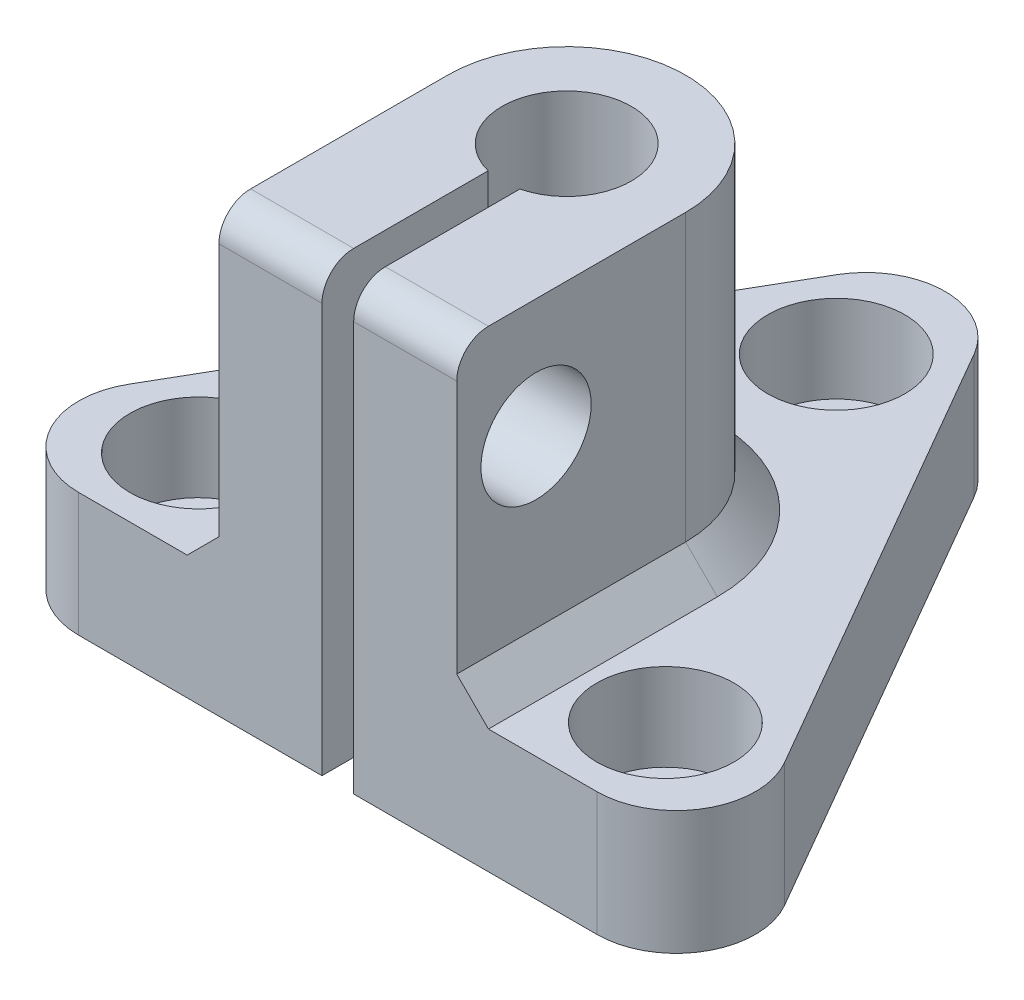
ISO-10303-21;
HEADER;
FILE_DESCRIPTION(('STEP AP214'),'2;1');
FILE_NAME('part.step','',(''),(''),'','','');
FILE_SCHEMA(('AUTOMOTIVE_DESIGN { 1 0 10303 214 1 1 1 1 }'));
ENDSEC;
DATA;
#1=APPLICATION_CONTEXT('core data for automotive mechanical design processes');
#2=APPLICATION_PROTOCOL_DEFINITION('international standard','automotive_design',2000,#1);
#3=PRODUCT_CONTEXT('',#1,'mechanical');
#4=PRODUCT('Part','Part','',(#3));
#5=PRODUCT_RELATED_PRODUCT_CATEGORY('part','',(#4));
#6=PRODUCT_DEFINITION_FORMATION('','',#4);
#7=PRODUCT_DEFINITION_CONTEXT('part definition',#1,'design');
#8=PRODUCT_DEFINITION('design','',#6,#7);
#9=PRODUCT_DEFINITION_SHAPE('','',#8);
#10=(LENGTH_UNIT() NAMED_UNIT(*) SI_UNIT(.MILLI.,.METRE.));
#11=(NAMED_UNIT(*) PLANE_ANGLE_UNIT() SI_UNIT($,.RADIAN.));
#12=(NAMED_UNIT(*) SI_UNIT($,.STERADIAN.) SOLID_ANGLE_UNIT());
#13=UNCERTAINTY_MEASURE_WITH_UNIT(LENGTH_MEASURE(1.E-05),#10,'distance_accuracy_value','');
#14=(GEOMETRIC_REPRESENTATION_CONTEXT(3) GLOBAL_UNCERTAINTY_ASSIGNED_CONTEXT((#13)) GLOBAL_UNIT_ASSIGNED_CONTEXT((#10,
#11,#12)) REPRESENTATION_CONTEXT('',''));
#15=CARTESIAN_POINT('',(0.,0.,0.));
#16=DIRECTION('',(0.,0.,1.));
#17=DIRECTION('',(1.,0.,0.));
#18=AXIS2_PLACEMENT_3D('',#15,#16,#17);
#19=CARTESIAN_POINT('',(-21.3397459621556,20.3,9.43375672974063));
#20=DIRECTION('',(1.,0.,0.));
#21=DIRECTION('',(0.,0.,-1.));
#22=AXIS2_PLACEMENT_3D('',#19,#20,#21);
#23=CYLINDRICAL_SURFACE('',#22,2.05);
#24=CARTESIAN_POINT('',(1.,20.3,9.43375672974064));
#25=DIRECTION('',(1.,0.,0.));
#26=DIRECTION('',(0.,0.,-1.));
#27=AXIS2_PLACEMENT_3D('',#24,#25,#26);
#28=CIRCLE('',#27,2.05);
#29=CARTESIAN_POINT('',(1.,20.3,7.38375672974064));
#30=VERTEX_POINT('',#29);
#31=EDGE_CURVE('E292',#30,#30,#28,.T.);
#32=ORIENTED_EDGE('',*,*,#31,.F.);
#33=EDGE_LOOP('',(#32));
#34=FACE_BOUND('',#33,.T.);
#35=CARTESIAN_POINT('',(2.53,20.3,9.43375672974064));
#36=DIRECTION('',(1.,0.,0.));
#37=DIRECTION('',(0.,0.,-1.));
#38=AXIS2_PLACEMENT_3D('',#35,#36,#37);
#39=CIRCLE('',#38,2.05);
#40=CARTESIAN_POINT('',(2.53,20.3,7.38375672974064));
#41=VERTEX_POINT('',#40);
#42=EDGE_CURVE('E450',#41,#41,#39,.F.);
#43=ORIENTED_EDGE('',*,*,#42,.F.);
#44=EDGE_LOOP('',(#43));
#45=FACE_BOUND('',#44,.T.);
#46=ADVANCED_FACE('F41',(#34,#45),#23,.F.);
#47=CARTESIAN_POINT('',(0.,7.8,-17.));
#48=DIRECTION('',(0.,-1.,0.));
#49=DIRECTION('',(0.,0.,-1.));
#50=AXIS2_PLACEMENT_3D('',#47,#48,#49);
#51=CYLINDRICAL_SURFACE('',#50,2.575);
#52=CARTESIAN_POINT('',(0.,0.,-17.));
#53=DIRECTION('',(0.,1.,0.));
#54=DIRECTION('',(0.,0.,1.));
#55=AXIS2_PLACEMENT_3D('',#52,#53,#54);
#56=CIRCLE('',#55,2.575);
#57=CARTESIAN_POINT('',(0.,0.,-14.425));
#58=VERTEX_POINT('',#57);
#59=EDGE_CURVE('E362',#58,#58,#56,.T.);
#60=ORIENTED_EDGE('',*,*,#59,.F.);
#61=EDGE_LOOP('',(#60));
#62=FACE_BOUND('',#61,.T.);
#63=CARTESIAN_POINT('',(0.,2.3,-17.));
#64=DIRECTION('',(0.,1.,0.));
#65=DIRECTION('',(0.,0.,1.));
#66=AXIS2_PLACEMENT_3D('',#63,#64,#65);
#67=CIRCLE('',#66,2.575);
#68=CARTESIAN_POINT('',(0.,2.3,-14.425));
#69=VERTEX_POINT('',#68);
#70=EDGE_CURVE('E258',#69,#69,#67,.T.);
#71=ORIENTED_EDGE('',*,*,#70,.T.);
#72=EDGE_LOOP('',(#71));
#73=FACE_BOUND('',#72,.T.);
#74=ADVANCED_FACE('F585',(#62,#73),#51,.F.);
#75=CARTESIAN_POINT('',(-14.7224318643355,7.8,8.50000000000001));
#76=DIRECTION('',(0.,-1.,0.));
#77=DIRECTION('',(0.,0.,-1.));
#78=AXIS2_PLACEMENT_3D('',#75,#76,#77);
#79=CYLINDRICAL_SURFACE('',#78,2.575);
#80=CARTESIAN_POINT('',(-14.7224318643355,0.,8.50000000000001));
#81=DIRECTION('',(0.,1.,0.));
#82=DIRECTION('',(0.,0.,1.));
#83=AXIS2_PLACEMENT_3D('',#80,#81,#82);
#84=CIRCLE('',#83,2.575);
#85=CARTESIAN_POINT('',(-14.7224318643355,0.,11.075));
#86=VERTEX_POINT('',#85);
#87=EDGE_CURVE('E358',#86,#86,#84,.T.);
#88=ORIENTED_EDGE('',*,*,#87,.F.);
#89=EDGE_LOOP('',(#88));
#90=FACE_BOUND('',#89,.T.);
#91=CARTESIAN_POINT('',(-14.7224318643355,2.3,8.50000000000001));
#92=DIRECTION('',(0.,1.,0.));
#93=DIRECTION('',(0.,0.,1.));
#94=AXIS2_PLACEMENT_3D('',#91,#92,#93);
#95=CIRCLE('',#94,2.575);
#96=CARTESIAN_POINT('',(-14.7224318643355,2.3,11.075));
#97=VERTEX_POINT('',#96);
#98=EDGE_CURVE('E442',#97,#97,#95,.T.);
#99=ORIENTED_EDGE('',*,*,#98,.T.);
#100=EDGE_LOOP('',(#99));
#101=FACE_BOUND('',#100,.T.);
#102=ADVANCED_FACE('F592',(#90,#101),#79,.F.);
#103=CARTESIAN_POINT('',(14.7224318643355,7.8,8.5));
#104=DIRECTION('',(0.,-1.,0.));
#105=DIRECTION('',(0.,0.,-1.));
#106=AXIS2_PLACEMENT_3D('',#103,#104,#105);
#107=CYLINDRICAL_SURFACE('',#106,2.575);
#108=CARTESIAN_POINT('',(14.7224318643355,0.,8.5));
#109=DIRECTION('',(0.,1.,0.));
#110=DIRECTION('',(0.,0.,1.));
#111=AXIS2_PLACEMENT_3D('',#108,#109,#110);
#112=CIRCLE('',#111,2.575);
#113=CARTESIAN_POINT('',(14.7224318643355,0.,11.075));
#114=VERTEX_POINT('',#113);
#115=EDGE_CURVE('E354',#114,#114,#112,.T.);
#116=ORIENTED_EDGE('',*,*,#115,.F.);
#117=EDGE_LOOP('',(#116));
#118=FACE_BOUND('',#117,.T.);
#119=CARTESIAN_POINT('',(14.7224318643355,2.3,8.5));
#120=DIRECTION('',(0.,1.,0.));
#121=DIRECTION('',(0.,0.,1.));
#122=AXIS2_PLACEMENT_3D('',#119,#120,#121);
#123=CIRCLE('',#122,2.575);
#124=CARTESIAN_POINT('',(14.7224318643355,2.3,11.075));
#125=VERTEX_POINT('',#124);
#126=EDGE_CURVE('E438',#125,#125,#123,.T.);
#127=ORIENTED_EDGE('',*,*,#126,.T.);
#128=EDGE_LOOP('',(#127));
#129=FACE_BOUND('',#128,.T.);
#130=ADVANCED_FACE('F600',(#118,#129),#107,.F.);
#131=CARTESIAN_POINT('',(-1.,20.3,9.43375672974064));
#132=DIRECTION('',(-1.,0.,0.));
#133=DIRECTION('',(0.,0.,1.));
#134=AXIS2_PLACEMENT_3D('',#131,#132,#133);
#135=CIRCLE('',#134,2.05);
#136=CARTESIAN_POINT('',(-1.,20.3,11.4837567297406));
#137=VERTEX_POINT('',#136);
#138=EDGE_CURVE('E287',#137,#137,#135,.T.);
#139=ORIENTED_EDGE('',*,*,#138,.F.);
#140=EDGE_LOOP('',(#139));
#141=FACE_BOUND('',#140,.T.);
#142=CARTESIAN_POINT('',(-4.25,20.3,9.43375672974064));
#143=DIRECTION('',(-1.,0.,0.));
#144=DIRECTION('',(0.,0.,1.));
#145=AXIS2_PLACEMENT_3D('',#142,#143,#144);
#146=CIRCLE('',#145,2.05);
#147=CARTESIAN_POINT('',(-4.25,20.3,11.4837567297406));
#148=VERTEX_POINT('',#147);
#149=EDGE_CURVE('E275',#148,#148,#146,.F.);
#150=ORIENTED_EDGE('',*,*,#149,.F.);
#151=EDGE_LOOP('',(#150));
#152=FACE_BOUND('',#151,.T.);
#153=ADVANCED_FACE('F588',(#141,#152),#23,.F.);
#154=CARTESIAN_POINT('',(-25.,7.8,14.4337567297406));
#155=DIRECTION('',(0.,0.,-1.));
#156=DIRECTION('',(-1.,0.,0.));
#157=AXIS2_PLACEMENT_3D('',#154,#155,#156);
#158=PLANE('',#157);
#159=DIRECTION('',(1.,0.,0.));
#160=VECTOR('',#159,1.);
#161=CARTESIAN_POINT('',(-25.,7.8,14.4337567297406));
#162=LINE('',#161,#160);
#163=CARTESIAN_POINT('',(9.50000000000002,7.8,14.4337567297406));
#164=VERTEX_POINT('',#163);
#165=CARTESIAN_POINT('',(16.3397459621556,7.8,14.4337567297407));
#166=VERTEX_POINT('',#165);
#167=EDGE_CURVE('E371',#164,#166,#162,.T.);
#168=ORIENTED_EDGE('',*,*,#167,.F.);
#169=DIRECTION('',(0.707106781186551,-0.707106781186544,0.));
#170=VECTOR('',#169,1.);
#171=CARTESIAN_POINT('',(-7.75000000000015,25.05,14.4337567297406));
#172=LINE('',#171,#170);
#173=CARTESIAN_POINT('',(7.5,9.8,14.4337567297406));
#174=VERTEX_POINT('',#173);
#175=EDGE_CURVE('E11',#164,#174,#172,.F.);
#176=ORIENTED_EDGE('',*,*,#175,.T.);
#177=DIRECTION('',(0.,1.,0.));
#178=VECTOR('',#177,1.);
#179=CARTESIAN_POINT('',(7.5,-13.0166599946613,14.4337567297406));
#180=LINE('',#179,#178);
#181=CARTESIAN_POINT('',(7.5,25.8,14.4337567297406));
#182=VERTEX_POINT('',#181);
#183=EDGE_CURVE('E343',#174,#182,#180,.T.);
#184=ORIENTED_EDGE('',*,*,#183,.T.);
#185=DIRECTION('',(1.,0.,0.));
#186=VECTOR('',#185,1.);
#187=CARTESIAN_POINT('',(1.,25.8,14.4337567297406));
#188=LINE('',#187,#186);
#189=CARTESIAN_POINT('',(1.,25.8,14.4337567297406));
#190=VERTEX_POINT('',#189);
#191=EDGE_CURVE('E476',#182,#190,#188,.F.);
#192=ORIENTED_EDGE('',*,*,#191,.T.);
#193=DIRECTION('',(0.,1.,0.));
#194=VECTOR('',#193,1.);
#195=CARTESIAN_POINT('',(1.,0.,14.4337567297406));
#196=LINE('',#195,#194);
#197=CARTESIAN_POINT('',(1.,0.,14.4337567297406));
#198=VERTEX_POINT('',#197);
#199=EDGE_CURVE('E313',#198,#190,#196,.T.);
#200=ORIENTED_EDGE('',*,*,#199,.F.);
#201=DIRECTION('',(1.,0.,0.));
#202=VECTOR('',#201,1.);
#203=CARTESIAN_POINT('',(-25.,0.,14.4337567297406));
#204=LINE('',#203,#202);
#205=CARTESIAN_POINT('',(16.3397459621556,0.,14.4337567297407));
#206=VERTEX_POINT('',#205);
#207=EDGE_CURVE('E385',#198,#206,#204,.T.);
#208=ORIENTED_EDGE('',*,*,#207,.T.);
#209=DIRECTION('',(0.,-1.,0.));
#210=VECTOR('',#209,1.);
#211=CARTESIAN_POINT('',(16.3397459621556,7.8,14.4337567297407));
#212=LINE('',#211,#210);
#213=EDGE_CURVE('E427',#206,#166,#212,.F.);
#214=ORIENTED_EDGE('',*,*,#213,.T.);
#215=EDGE_LOOP('',(#168,#176,#184,#192,#200,#208,#214));
#216=FACE_BOUND('',#215,.T.);
#217=ADVANCED_FACE('F552',(#216),#158,.F.);
#218=CARTESIAN_POINT('',(0.,7.8,0.));
#219=DIRECTION('',(0.,1.,0.));
#220=DIRECTION('',(0.,0.,1.));
#221=AXIS2_PLACEMENT_3D('',#218,#219,#220);
#222=PLANE('',#221);
#223=CARTESIAN_POINT('',(0.,7.8,-17.));
#224=DIRECTION('',(0.,1.,0.));
#225=DIRECTION('',(0.,0.,1.));
#226=AXIS2_PLACEMENT_3D('',#223,#224,#225);
#227=CIRCLE('',#226,4.325);
#228=CARTESIAN_POINT('',(0.,7.8,-12.675));
#229=VERTEX_POINT('',#228);
#230=EDGE_CURVE('E526',#229,#229,#227,.T.);
#231=ORIENTED_EDGE('',*,*,#230,.F.);
#232=EDGE_LOOP('',(#231));
#233=FACE_BOUND('',#232,.T.);
#234=CARTESIAN_POINT('',(14.7224318643355,7.8,8.5));
#235=DIRECTION('',(0.,1.,0.));
#236=DIRECTION('',(0.,0.,1.));
#237=AXIS2_PLACEMENT_3D('',#234,#235,#236);
#238=CIRCLE('',#237,4.325);
#239=CARTESIAN_POINT('',(14.7224318643355,7.8,12.825));
#240=VERTEX_POINT('',#239);
#241=EDGE_CURVE('E534',#240,#240,#238,.T.);
#242=ORIENTED_EDGE('',*,*,#241,.F.);
#243=EDGE_LOOP('',(#242));
#244=FACE_BOUND('',#243,.T.);
#245=CARTESIAN_POINT('',(-14.7224318643355,7.8,8.50000000000001));
#246=DIRECTION('',(0.,1.,0.));
#247=DIRECTION('',(0.,0.,1.));
#248=AXIS2_PLACEMENT_3D('',#245,#246,#247);
#249=CIRCLE('',#248,4.325);
#250=CARTESIAN_POINT('',(-14.7224318643355,7.8,12.825));
#251=VERTEX_POINT('',#250);
#252=EDGE_CURVE('E241',#251,#251,#249,.T.);
#253=ORIENTED_EDGE('',*,*,#252,.F.);
#254=EDGE_LOOP('',(#253));
#255=FACE_BOUND('',#254,.T.);
#256=CARTESIAN_POINT('',(-16.3397459621556,7.8,14.4337567297406));
#257=VERTEX_POINT('',#256);
#258=CARTESIAN_POINT('',(-9.50000000000002,7.8,14.4337567297406));
#259=VERTEX_POINT('',#258);
#260=EDGE_CURVE('E373',#257,#259,#162,.T.);
#261=ORIENTED_EDGE('',*,*,#260,.T.);
#262=DIRECTION('',(0.,0.,-1.));
#263=VECTOR('',#262,1.);
#264=CARTESIAN_POINT('',(-9.50000000000002,7.8,0.));
#265=LINE('',#264,#263);
#266=CARTESIAN_POINT('',(-9.50000000000002,7.8,0.));
#267=VERTEX_POINT('',#266);
#268=EDGE_CURVE('E488',#259,#267,#265,.T.);
#269=ORIENTED_EDGE('',*,*,#268,.T.);
#270=CARTESIAN_POINT('',(0.,7.8,0.));
#271=DIRECTION('',(0.,1.,0.));
#272=DIRECTION('',(0.,0.,1.));
#273=AXIS2_PLACEMENT_3D('',#270,#271,#272);
#274=CIRCLE('',#273,9.50000000000002);
#275=CARTESIAN_POINT('',(9.50000000000002,7.8,0.));
#276=VERTEX_POINT('',#275);
#277=EDGE_CURVE('E485',#267,#276,#274,.F.);
#278=ORIENTED_EDGE('',*,*,#277,.T.);
#279=DIRECTION('',(0.,0.,1.));
#280=VECTOR('',#279,1.);
#281=CARTESIAN_POINT('',(9.50000000000002,7.8,14.4337567297406));
#282=LINE('',#281,#280);
#283=EDGE_CURVE('E482',#276,#164,#282,.T.);
#284=ORIENTED_EDGE('',*,*,#283,.T.);
#285=ORIENTED_EDGE('',*,*,#167,.T.);
#286=CARTESIAN_POINT('',(16.3397459621556,7.8,9.43375672974065));
#287=DIRECTION('',(0.,1.,0.));
#288=DIRECTION('',(0.,0.,1.));
#289=AXIS2_PLACEMENT_3D('',#286,#287,#288);
#290=CIRCLE('',#289,5.);
#291=CARTESIAN_POINT('',(20.6698729810778,7.8,6.93375672974065));
#292=VERTEX_POINT('',#291);
#293=EDGE_CURVE('E414',#166,#292,#290,.T.);
#294=ORIENTED_EDGE('',*,*,#293,.T.);
#295=DIRECTION('',(-0.5,0.,-0.866025403784439));
#296=VECTOR('',#295,1.);
#297=CARTESIAN_POINT('',(25.,7.8,14.4337567297407));
#298=LINE('',#297,#296);
#299=CARTESIAN_POINT('',(4.33012701892219,7.8,-21.3675134594813));
#300=VERTEX_POINT('',#299);
#301=EDGE_CURVE('E377',#292,#300,#298,.T.);
#302=ORIENTED_EDGE('',*,*,#301,.T.);
#303=CARTESIAN_POINT('',(0.,7.8,-18.8675134594813));
#304=DIRECTION('',(0.,1.,0.));
#305=DIRECTION('',(0.,0.,1.));
#306=AXIS2_PLACEMENT_3D('',#303,#304,#305);
#307=CIRCLE('',#306,5.);
#308=CARTESIAN_POINT('',(-4.33012701892219,7.8,-21.3675134594813));
#309=VERTEX_POINT('',#308);
#310=EDGE_CURVE('E420',#300,#309,#307,.T.);
#311=ORIENTED_EDGE('',*,*,#310,.T.);
#312=DIRECTION('',(-0.5,0.,0.866025403784438));
#313=VECTOR('',#312,1.);
#314=CARTESIAN_POINT('',(0.,7.8,-28.8675134594813));
#315=LINE('',#314,#313);
#316=CARTESIAN_POINT('',(-20.6698729810778,7.8,6.93375672974063));
#317=VERTEX_POINT('',#316);
#318=EDGE_CURVE('E367',#309,#317,#315,.T.);
#319=ORIENTED_EDGE('',*,*,#318,.T.);
#320=CARTESIAN_POINT('',(-16.3397459621556,7.8,9.43375672974064));
#321=DIRECTION('',(0.,1.,0.));
#322=DIRECTION('',(0.,0.,1.));
#323=AXIS2_PLACEMENT_3D('',#320,#321,#322);
#324=CIRCLE('',#323,5.);
#325=EDGE_CURVE('E417',#317,#257,#324,.T.);
#326=ORIENTED_EDGE('',*,*,#325,.T.);
#327=EDGE_LOOP('',(#261,#269,#278,#284,#285,#294,#302,#311,#319,#326));
#328=FACE_BOUND('',#327,.T.);
#329=ADVANCED_FACE('F548',(#233,#244,#255,#328),#222,.T.);
#330=CARTESIAN_POINT('',(0.,0.,0.));
#331=DIRECTION('',(0.,1.,0.));
#332=DIRECTION('',(0.,0.,1.));
#333=AXIS2_PLACEMENT_3D('',#330,#331,#332);
#334=PLANE('',#333);
#335=DIRECTION('',(-0.5,0.,0.866025403784438));
#336=VECTOR('',#335,1.);
#337=CARTESIAN_POINT('',(0.,0.,-28.8675134594813));
#338=LINE('',#337,#336);
#339=CARTESIAN_POINT('',(-4.33012701892219,0.,-21.3675134594813));
#340=VERTEX_POINT('',#339);
#341=CARTESIAN_POINT('',(-20.6698729810778,0.,6.93375672974063));
#342=VERTEX_POINT('',#341);
#343=EDGE_CURVE('E366',#340,#342,#338,.T.);
#344=ORIENTED_EDGE('',*,*,#343,.F.);
#345=CARTESIAN_POINT('',(0.,0.,-18.8675134594813));
#346=DIRECTION('',(0.,1.,0.));
#347=DIRECTION('',(0.,0.,1.));
#348=AXIS2_PLACEMENT_3D('',#345,#346,#347);
#349=CIRCLE('',#348,5.);
#350=CARTESIAN_POINT('',(4.33012701892219,0.,-21.3675134594813));
#351=VERTEX_POINT('',#350);
#352=EDGE_CURVE('E404',#340,#351,#349,.F.);
#353=ORIENTED_EDGE('',*,*,#352,.T.);
#354=DIRECTION('',(-0.5,0.,-0.866025403784439));
#355=VECTOR('',#354,1.);
#356=CARTESIAN_POINT('',(25.,0.,14.4337567297407));
#357=LINE('',#356,#355);
#358=CARTESIAN_POINT('',(20.6698729810778,0.,6.93375672974065));
#359=VERTEX_POINT('',#358);
#360=EDGE_CURVE('E372',#359,#351,#357,.T.);
#361=ORIENTED_EDGE('',*,*,#360,.F.);
#362=CARTESIAN_POINT('',(16.3397459621556,0.,9.43375672974065));
#363=DIRECTION('',(0.,1.,0.));
#364=DIRECTION('',(0.,0.,1.));
#365=AXIS2_PLACEMENT_3D('',#362,#363,#364);
#366=CIRCLE('',#365,5.);
#367=EDGE_CURVE('E398',#359,#206,#366,.F.);
#368=ORIENTED_EDGE('',*,*,#367,.T.);
#369=ORIENTED_EDGE('',*,*,#207,.F.);
#370=DIRECTION('',(0.,0.,-1.));
#371=VECTOR('',#370,1.);
#372=CARTESIAN_POINT('',(1.,0.,3.95555305867587));
#373=LINE('',#372,#371);
#374=CARTESIAN_POINT('',(1.,0.,3.95555305867587));
#375=VERTEX_POINT('',#374);
#376=EDGE_CURVE('E297',#198,#375,#373,.T.);
#377=ORIENTED_EDGE('',*,*,#376,.T.);
#378=CARTESIAN_POINT('',(0.,0.,0.));
#379=DIRECTION('',(0.,1.,0.));
#380=DIRECTION('',(0.,0.,1.));
#381=AXIS2_PLACEMENT_3D('',#378,#379,#380);
#382=CIRCLE('',#381,4.08);
#383=CARTESIAN_POINT('',(-1.,0.,3.95555305867587));
#384=VERTEX_POINT('',#383);
#385=EDGE_CURVE('E323',#375,#384,#382,.T.);
#386=ORIENTED_EDGE('',*,*,#385,.T.);
#387=DIRECTION('',(0.,0.,1.));
#388=VECTOR('',#387,1.);
#389=CARTESIAN_POINT('',(-1.,0.,3.95555305867587));
#390=LINE('',#389,#388);
#391=CARTESIAN_POINT('',(-1.,0.,14.4337567297406));
#392=VERTEX_POINT('',#391);
#393=EDGE_CURVE('E293',#384,#392,#390,.T.);
#394=ORIENTED_EDGE('',*,*,#393,.T.);
#395=CARTESIAN_POINT('',(-16.3397459621556,0.,14.4337567297406));
#396=VERTEX_POINT('',#395);
#397=EDGE_CURVE('E386',#396,#392,#204,.T.);
#398=ORIENTED_EDGE('',*,*,#397,.F.);
#399=CARTESIAN_POINT('',(-16.3397459621556,0.,9.43375672974064));
#400=DIRECTION('',(0.,1.,0.));
#401=DIRECTION('',(0.,0.,1.));
#402=AXIS2_PLACEMENT_3D('',#399,#400,#401);
#403=CIRCLE('',#402,5.);
#404=EDGE_CURVE('E401',#396,#342,#403,.F.);
#405=ORIENTED_EDGE('',*,*,#404,.T.);
#406=EDGE_LOOP('',(#344,#353,#361,#368,#369,#377,#386,#394,#398,#405));
#407=FACE_BOUND('',#406,.T.);
#408=ORIENTED_EDGE('',*,*,#59,.T.);
#409=EDGE_LOOP('',(#408));
#410=FACE_BOUND('',#409,.T.);
#411=ORIENTED_EDGE('',*,*,#87,.T.);
#412=EDGE_LOOP('',(#411));
#413=FACE_BOUND('',#412,.T.);
#414=ORIENTED_EDGE('',*,*,#115,.T.);
#415=EDGE_LOOP('',(#414));
#416=FACE_BOUND('',#415,.T.);
#417=ADVANCED_FACE('F551',(#407,#410,#413,#416),#334,.F.);
#418=CARTESIAN_POINT('',(0.,7.8,-28.8675134594813));
#419=DIRECTION('',(0.866025403784439,0.,0.5));
#420=DIRECTION('',(0.5,0.,-0.866025403784439));
#421=AXIS2_PLACEMENT_3D('',#418,#419,#420);
#422=PLANE('',#421);
#423=ORIENTED_EDGE('',*,*,#318,.F.);
#424=DIRECTION('',(0.,-1.,0.));
#425=VECTOR('',#424,1.);
#426=CARTESIAN_POINT('',(-4.33012701892219,7.8,-21.3675134594813));
#427=LINE('',#426,#425);
#428=EDGE_CURVE('E394',#309,#340,#427,.T.);
#429=ORIENTED_EDGE('',*,*,#428,.T.);
#430=ORIENTED_EDGE('',*,*,#343,.T.);
#431=DIRECTION('',(0.,-1.,0.));
#432=VECTOR('',#431,1.);
#433=CARTESIAN_POINT('',(-20.6698729810778,7.8,6.93375672974064));
#434=LINE('',#433,#432);
#435=EDGE_CURVE('E381',#342,#317,#434,.F.);
#436=ORIENTED_EDGE('',*,*,#435,.T.);
#437=EDGE_LOOP('',(#423,#429,#430,#436));
#438=FACE_BOUND('',#437,.T.);
#439=ADVANCED_FACE('F680',(#438),#422,.F.);
#440=DIRECTION('',(0.,1.,0.));
#441=VECTOR('',#440,1.);
#442=CARTESIAN_POINT('',(-1.,0.,14.4337567297406));
#443=LINE('',#442,#441);
#444=CARTESIAN_POINT('',(-1.,25.8,14.4337567297406));
#445=VERTEX_POINT('',#444);
#446=EDGE_CURVE('E317',#392,#445,#443,.T.);
#447=ORIENTED_EDGE('',*,*,#446,.T.);
#448=DIRECTION('',(1.,0.,0.));
#449=VECTOR('',#448,1.);
#450=CARTESIAN_POINT('',(-7.5,25.8,14.4337567297406));
#451=LINE('',#450,#449);
#452=CARTESIAN_POINT('',(-7.5,25.8,14.4337567297406));
#453=VERTEX_POINT('',#452);
#454=EDGE_CURVE('E465',#445,#453,#451,.F.);
#455=ORIENTED_EDGE('',*,*,#454,.T.);
#456=DIRECTION('',(0.,1.,0.));
#457=VECTOR('',#456,1.);
#458=CARTESIAN_POINT('',(-7.5,-13.0166599946613,14.4337567297406));
#459=LINE('',#458,#457);
#460=CARTESIAN_POINT('',(-7.5,9.8,14.4337567297406));
#461=VERTEX_POINT('',#460);
#462=EDGE_CURVE('E346',#461,#453,#459,.T.);
#463=ORIENTED_EDGE('',*,*,#462,.F.);
#464=DIRECTION('',(0.707106781186551,0.707106781186544,0.));
#465=VECTOR('',#464,1.);
#466=CARTESIAN_POINT('',(-17.2500000000001,0.050000000000011,14.4337567297406));
#467=LINE('',#466,#465);
#468=EDGE_CURVE('E52',#461,#259,#467,.F.);
#469=ORIENTED_EDGE('',*,*,#468,.T.);
#470=ORIENTED_EDGE('',*,*,#260,.F.);
#471=DIRECTION('',(0.,-1.,0.));
#472=VECTOR('',#471,1.);
#473=CARTESIAN_POINT('',(-16.3397459621556,7.8,14.4337567297406));
#474=LINE('',#473,#472);
#475=EDGE_CURVE('E423',#257,#396,#474,.T.);
#476=ORIENTED_EDGE('',*,*,#475,.T.);
#477=ORIENTED_EDGE('',*,*,#397,.T.);
#478=EDGE_LOOP('',(#447,#455,#463,#469,#470,#476,#477));
#479=FACE_BOUND('',#478,.T.);
#480=ADVANCED_FACE('F562',(#479),#158,.F.);
#481=CARTESIAN_POINT('',(25.,7.8,14.4337567297407));
#482=DIRECTION('',(-0.866025403784439,0.,0.5));
#483=DIRECTION('',(0.5,0.,0.866025403784439));
#484=AXIS2_PLACEMENT_3D('',#481,#482,#483);
#485=PLANE('',#484);
#486=ORIENTED_EDGE('',*,*,#360,.T.);
#487=DIRECTION('',(0.,-1.,0.));
#488=VECTOR('',#487,1.);
#489=CARTESIAN_POINT('',(4.33012701892219,7.8,-21.3675134594813));
#490=LINE('',#489,#488);
#491=EDGE_CURVE('E411',#351,#300,#490,.F.);
#492=ORIENTED_EDGE('',*,*,#491,.T.);
#493=ORIENTED_EDGE('',*,*,#301,.F.);
#494=DIRECTION('',(0.,-1.,0.));
#495=VECTOR('',#494,1.);
#496=CARTESIAN_POINT('',(20.6698729810778,7.8,6.93375672974065));
#497=LINE('',#496,#495);
#498=EDGE_CURVE('E407',#292,#359,#497,.T.);
#499=ORIENTED_EDGE('',*,*,#498,.T.);
#500=EDGE_LOOP('',(#486,#492,#493,#499));
#501=FACE_BOUND('',#500,.T.);
#502=ADVANCED_FACE('F682',(#501),#485,.F.);
#503=CARTESIAN_POINT('',(0.,27.8,0.));
#504=DIRECTION('',(0.,-1.,0.));
#505=DIRECTION('',(0.,0.,-1.));
#506=AXIS2_PLACEMENT_3D('',#503,#504,#505);
#507=CYLINDRICAL_SURFACE('',#506,7.5);
#508=DIRECTION('',(0.,1.,0.));
#509=VECTOR('',#508,1.);
#510=CARTESIAN_POINT('',(7.5,-13.0166599946613,0.));
#511=LINE('',#510,#509);
#512=CARTESIAN_POINT('',(7.5,9.8,0.));
#513=VERTEX_POINT('',#512);
#514=CARTESIAN_POINT('',(7.5,27.8,0.));
#515=VERTEX_POINT('',#514);
#516=EDGE_CURVE('E339',#513,#515,#511,.T.);
#517=ORIENTED_EDGE('',*,*,#516,.F.);
#518=CARTESIAN_POINT('',(0.,9.8,0.));
#519=DIRECTION('',(0.,1.,0.));
#520=DIRECTION('',(0.,0.,1.));
#521=AXIS2_PLACEMENT_3D('',#518,#519,#520);
#522=CIRCLE('',#521,7.5);
#523=CARTESIAN_POINT('',(-7.5,9.8,0.));
#524=VERTEX_POINT('',#523);
#525=EDGE_CURVE('E495',#513,#524,#522,.T.);
#526=ORIENTED_EDGE('',*,*,#525,.T.);
#527=DIRECTION('',(0.,1.,0.));
#528=VECTOR('',#527,1.);
#529=CARTESIAN_POINT('',(-7.5,-13.0166599946613,0.));
#530=LINE('',#529,#528);
#531=CARTESIAN_POINT('',(-7.5,27.8,0.));
#532=VERTEX_POINT('',#531);
#533=EDGE_CURVE('E338',#524,#532,#530,.T.);
#534=ORIENTED_EDGE('',*,*,#533,.T.);
#535=CARTESIAN_POINT('',(0.,27.8,0.));
#536=DIRECTION('',(0.,1.,0.));
#537=DIRECTION('',(0.,0.,1.));
#538=AXIS2_PLACEMENT_3D('',#535,#536,#537);
#539=CIRCLE('',#538,7.5);
#540=EDGE_CURVE('E342',#515,#532,#539,.T.);
#541=ORIENTED_EDGE('',*,*,#540,.F.);
#542=EDGE_LOOP('',(#517,#526,#534,#541));
#543=FACE_BOUND('',#542,.T.);
#544=ADVANCED_FACE('F571',(#543),#507,.T.);
#545=CARTESIAN_POINT('',(0.,27.8,0.));
#546=DIRECTION('',(0.,1.,0.));
#547=DIRECTION('',(0.,0.,1.));
#548=AXIS2_PLACEMENT_3D('',#545,#546,#547);
#549=PLANE('',#548);
#550=DIRECTION('',(0.,0.,1.));
#551=VECTOR('',#550,1.);
#552=CARTESIAN_POINT('',(-7.5,27.8,0.));
#553=LINE('',#552,#551);
#554=CARTESIAN_POINT('',(-7.5,27.8,12.4337567297406));
#555=VERTEX_POINT('',#554);
#556=EDGE_CURVE('E327',#532,#555,#553,.T.);
#557=ORIENTED_EDGE('',*,*,#556,.T.);
#558=DIRECTION('',(1.,0.,0.));
#559=VECTOR('',#558,1.);
#560=CARTESIAN_POINT('',(-0.999999999999999,27.8,12.4337567297406));
#561=LINE('',#560,#559);
#562=CARTESIAN_POINT('',(-1.,27.8,12.4337567297406));
#563=VERTEX_POINT('',#562);
#564=EDGE_CURVE('E458',#555,#563,#561,.T.);
#565=ORIENTED_EDGE('',*,*,#564,.T.);
#566=DIRECTION('',(0.,0.,1.));
#567=VECTOR('',#566,1.);
#568=CARTESIAN_POINT('',(-1.,27.8,3.95555305867587));
#569=LINE('',#568,#567);
#570=CARTESIAN_POINT('',(-1.,27.8,3.95555305867587));
#571=VERTEX_POINT('',#570);
#572=EDGE_CURVE('E291',#571,#563,#569,.T.);
#573=ORIENTED_EDGE('',*,*,#572,.F.);
#574=CARTESIAN_POINT('',(0.,27.8,0.));
#575=DIRECTION('',(0.,1.,0.));
#576=DIRECTION('',(0.,0.,1.));
#577=AXIS2_PLACEMENT_3D('',#574,#575,#576);
#578=CIRCLE('',#577,4.08);
#579=CARTESIAN_POINT('',(1.,27.8,3.95555305867587));
#580=VERTEX_POINT('',#579);
#581=EDGE_CURVE('E312',#580,#571,#578,.T.);
#582=ORIENTED_EDGE('',*,*,#581,.F.);
#583=DIRECTION('',(0.,0.,-1.));
#584=VECTOR('',#583,1.);
#585=CARTESIAN_POINT('',(1.,27.8,3.95555305867587));
#586=LINE('',#585,#584);
#587=CARTESIAN_POINT('',(1.,27.8,12.4337567297406));
#588=VERTEX_POINT('',#587);
#589=EDGE_CURVE('E298',#588,#580,#586,.T.);
#590=ORIENTED_EDGE('',*,*,#589,.F.);
#591=DIRECTION('',(1.,0.,0.));
#592=VECTOR('',#591,1.);
#593=CARTESIAN_POINT('',(7.5,27.8,12.4337567297406));
#594=LINE('',#593,#592);
#595=CARTESIAN_POINT('',(7.5,27.8,12.4337567297406));
#596=VERTEX_POINT('',#595);
#597=EDGE_CURVE('E431',#588,#596,#594,.T.);
#598=ORIENTED_EDGE('',*,*,#597,.T.);
#599=DIRECTION('',(0.,0.,-1.));
#600=VECTOR('',#599,1.);
#601=CARTESIAN_POINT('',(7.5,27.8,0.));
#602=LINE('',#601,#600);
#603=EDGE_CURVE('E334',#596,#515,#602,.T.);
#604=ORIENTED_EDGE('',*,*,#603,.T.);
#605=ORIENTED_EDGE('',*,*,#540,.T.);
#606=EDGE_LOOP('',(#557,#565,#573,#582,#590,#598,#604,#605));
#607=FACE_BOUND('',#606,.T.);
#608=ADVANCED_FACE('F744',(#607),#549,.T.);
#609=CARTESIAN_POINT('',(7.5,-13.0166599946613,0.));
#610=DIRECTION('',(1.,0.,0.));
#611=DIRECTION('',(0.,0.,-1.));
#612=AXIS2_PLACEMENT_3D('',#609,#610,#611);
#613=PLANE('',#612);
#614=CARTESIAN_POINT('',(7.5,20.3,9.43375672974064));
#615=DIRECTION('',(1.,0.,0.));
#616=DIRECTION('',(0.,0.,-1.));
#617=AXIS2_PLACEMENT_3D('',#614,#615,#616);
#618=CIRCLE('',#617,3.475);
#619=CARTESIAN_POINT('',(7.5,20.3,5.95875672974064));
#620=VERTEX_POINT('',#619);
#621=EDGE_CURVE('E510',#620,#620,#618,.T.);
#622=ORIENTED_EDGE('',*,*,#621,.F.);
#623=EDGE_LOOP('',(#622));
#624=FACE_BOUND('',#623,.T.);
#625=ORIENTED_EDGE('',*,*,#183,.F.);
#626=DIRECTION('',(0.,0.,-1.));
#627=VECTOR('',#626,1.);
#628=CARTESIAN_POINT('',(7.5,9.8,0.));
#629=LINE('',#628,#627);
#630=EDGE_CURVE('E65',#174,#513,#629,.T.);
#631=ORIENTED_EDGE('',*,*,#630,.T.);
#632=ORIENTED_EDGE('',*,*,#516,.T.);
#633=ORIENTED_EDGE('',*,*,#603,.F.);
#634=CARTESIAN_POINT('',(7.5,25.8,12.4337567297406));
#635=DIRECTION('',(1.,0.,0.));
#636=DIRECTION('',(0.,0.,-1.));
#637=AXIS2_PLACEMENT_3D('',#634,#635,#636);
#638=CIRCLE('',#637,2.);
#639=EDGE_CURVE('E472',#596,#182,#638,.T.);
#640=ORIENTED_EDGE('',*,*,#639,.T.);
#641=EDGE_LOOP('',(#625,#631,#632,#633,#640));
#642=FACE_BOUND('',#641,.T.);
#643=ADVANCED_FACE('F732',(#624,#642),#613,.T.);
#644=CARTESIAN_POINT('',(-7.5,-13.0166599946613,0.));
#645=DIRECTION('',(-1.,0.,0.));
#646=DIRECTION('',(0.,0.,1.));
#647=AXIS2_PLACEMENT_3D('',#644,#645,#646);
#648=PLANE('',#647);
#649=DIRECTION('',(0.,0.866025403784439,-0.5));
#650=VECTOR('',#649,1.);
#651=CARTESIAN_POINT('',(-7.5,20.3,13.5040761275275));
#652=LINE('',#651,#650);
#653=CARTESIAN_POINT('',(-7.5,20.3,13.5040761275275));
#654=VERTEX_POINT('',#653);
#655=CARTESIAN_POINT('',(-7.5,23.825,11.4689164286341));
#656=VERTEX_POINT('',#655);
#657=EDGE_CURVE('E212',#654,#656,#652,.T.);
#658=ORIENTED_EDGE('',*,*,#657,.F.);
#659=DIRECTION('',(0.,0.866025403784439,0.5));
#660=VECTOR('',#659,1.);
#661=CARTESIAN_POINT('',(-7.5,16.775,11.4689164286341));
#662=LINE('',#661,#660);
#663=CARTESIAN_POINT('',(-7.5,16.775,11.4689164286341));
#664=VERTEX_POINT('',#663);
#665=EDGE_CURVE('E234',#664,#654,#662,.T.);
#666=ORIENTED_EDGE('',*,*,#665,.F.);
#667=DIRECTION('',(0.,0.,1.));
#668=VECTOR('',#667,1.);
#669=CARTESIAN_POINT('',(-7.5,16.775,7.39859703084721));
#670=LINE('',#669,#668);
#671=CARTESIAN_POINT('',(-7.5,16.775,7.39859703084721));
#672=VERTEX_POINT('',#671);
#673=EDGE_CURVE('E238',#672,#664,#670,.T.);
#674=ORIENTED_EDGE('',*,*,#673,.F.);
#675=DIRECTION('',(0.,-0.866025403784439,0.5));
#676=VECTOR('',#675,1.);
#677=CARTESIAN_POINT('',(-7.5,20.3,5.36343733195377));
#678=LINE('',#677,#676);
#679=CARTESIAN_POINT('',(-7.5,20.3,5.36343733195377));
#680=VERTEX_POINT('',#679);
#681=EDGE_CURVE('E265',#680,#672,#678,.T.);
#682=ORIENTED_EDGE('',*,*,#681,.F.);
#683=DIRECTION('',(0.,-0.866025403784439,-0.5));
#684=VECTOR('',#683,1.);
#685=CARTESIAN_POINT('',(-7.5,23.825,7.3985970308472));
#686=LINE('',#685,#684);
#687=CARTESIAN_POINT('',(-7.5,23.825,7.3985970308472));
#688=VERTEX_POINT('',#687);
#689=EDGE_CURVE('E261',#688,#680,#686,.T.);
#690=ORIENTED_EDGE('',*,*,#689,.F.);
#691=DIRECTION('',(0.,0.,-1.));
#692=VECTOR('',#691,1.);
#693=CARTESIAN_POINT('',(-7.5,23.825,11.4689164286341));
#694=LINE('',#693,#692);
#695=EDGE_CURVE('E257',#656,#688,#694,.T.);
#696=ORIENTED_EDGE('',*,*,#695,.F.);
#697=EDGE_LOOP('',(#658,#666,#674,#682,#690,#696));
#698=FACE_BOUND('',#697,.T.);
#699=ORIENTED_EDGE('',*,*,#533,.F.);
#700=DIRECTION('',(0.,0.,1.));
#701=VECTOR('',#700,1.);
#702=CARTESIAN_POINT('',(-7.5,9.8,14.4337567297406));
#703=LINE('',#702,#701);
#704=EDGE_CURVE('E492',#524,#461,#703,.T.);
#705=ORIENTED_EDGE('',*,*,#704,.T.);
#706=ORIENTED_EDGE('',*,*,#462,.T.);
#707=CARTESIAN_POINT('',(-7.5,25.8,12.4337567297406));
#708=DIRECTION('',(-1.,0.,0.));
#709=DIRECTION('',(0.,0.,1.));
#710=AXIS2_PLACEMENT_3D('',#707,#708,#709);
#711=CIRCLE('',#710,2.);
#712=EDGE_CURVE('E469',#453,#555,#711,.T.);
#713=ORIENTED_EDGE('',*,*,#712,.T.);
#714=ORIENTED_EDGE('',*,*,#556,.F.);
#715=EDGE_LOOP('',(#699,#705,#706,#713,#714));
#716=FACE_BOUND('',#715,.T.);
#717=ADVANCED_FACE('F567',(#698,#716),#648,.T.);
#718=CARTESIAN_POINT('',(0.,0.,0.));
#719=DIRECTION('',(0.,1.,0.));
#720=DIRECTION('',(0.,0.,1.));
#721=AXIS2_PLACEMENT_3D('',#718,#719,#720);
#722=CYLINDRICAL_SURFACE('',#721,4.08);
#723=ORIENTED_EDGE('',*,*,#385,.F.);
#724=DIRECTION('',(0.,1.,0.));
#725=VECTOR('',#724,1.);
#726=CARTESIAN_POINT('',(1.,0.,3.95555305867587));
#727=LINE('',#726,#725);
#728=EDGE_CURVE('E308',#375,#580,#727,.T.);
#729=ORIENTED_EDGE('',*,*,#728,.T.);
#730=ORIENTED_EDGE('',*,*,#581,.T.);
#731=DIRECTION('',(0.,1.,0.));
#732=VECTOR('',#731,1.);
#733=CARTESIAN_POINT('',(-1.,0.,3.95555305867587));
#734=LINE('',#733,#732);
#735=EDGE_CURVE('E302',#384,#571,#734,.T.);
#736=ORIENTED_EDGE('',*,*,#735,.F.);
#737=EDGE_LOOP('',(#723,#729,#730,#736));
#738=FACE_BOUND('',#737,.T.);
#739=ADVANCED_FACE('F731',(#738),#722,.F.);
#740=CARTESIAN_POINT('',(-1.,0.,3.95555305867587));
#741=DIRECTION('',(-1.,0.,0.));
#742=DIRECTION('',(0.,0.,1.));
#743=AXIS2_PLACEMENT_3D('',#740,#741,#742);
#744=PLANE('',#743);
#745=ORIENTED_EDGE('',*,*,#138,.T.);
#746=EDGE_LOOP('',(#745));
#747=FACE_BOUND('',#746,.T.);
#748=ORIENTED_EDGE('',*,*,#572,.T.);
#749=CARTESIAN_POINT('',(-1.,25.8,12.4337567297406));
#750=DIRECTION('',(-1.,0.,0.));
#751=DIRECTION('',(0.,0.,1.));
#752=AXIS2_PLACEMENT_3D('',#749,#750,#751);
#753=CIRCLE('',#752,2.);
#754=EDGE_CURVE('E462',#563,#445,#753,.F.);
#755=ORIENTED_EDGE('',*,*,#754,.T.);
#756=ORIENTED_EDGE('',*,*,#446,.F.);
#757=ORIENTED_EDGE('',*,*,#393,.F.);
#758=ORIENTED_EDGE('',*,*,#735,.T.);
#759=EDGE_LOOP('',(#748,#755,#756,#757,#758));
#760=FACE_BOUND('',#759,.T.);
#761=ADVANCED_FACE('F800',(#747,#760),#744,.F.);
#762=CARTESIAN_POINT('',(1.,0.,3.95555305867587));
#763=DIRECTION('',(1.,0.,0.));
#764=DIRECTION('',(0.,0.,-1.));
#765=AXIS2_PLACEMENT_3D('',#762,#763,#764);
#766=PLANE('',#765);
#767=ORIENTED_EDGE('',*,*,#31,.T.);
#768=EDGE_LOOP('',(#767));
#769=FACE_BOUND('',#768,.T.);
#770=ORIENTED_EDGE('',*,*,#199,.T.);
#771=CARTESIAN_POINT('',(1.,25.8,12.4337567297406));
#772=DIRECTION('',(1.,0.,0.));
#773=DIRECTION('',(0.,0.,-1.));
#774=AXIS2_PLACEMENT_3D('',#771,#772,#773);
#775=CIRCLE('',#774,2.);
#776=EDGE_CURVE('E479',#190,#588,#775,.F.);
#777=ORIENTED_EDGE('',*,*,#776,.T.);
#778=ORIENTED_EDGE('',*,*,#589,.T.);
#779=ORIENTED_EDGE('',*,*,#728,.F.);
#780=ORIENTED_EDGE('',*,*,#376,.F.);
#781=EDGE_LOOP('',(#770,#777,#778,#779,#780));
#782=FACE_BOUND('',#781,.T.);
#783=ADVANCED_FACE('F693',(#769,#782),#766,.F.);
#784=CARTESIAN_POINT('',(0.,7.8,-18.8675134594813));
#785=DIRECTION('',(0.,-1.,0.));
#786=DIRECTION('',(0.,0.,-1.));
#787=AXIS2_PLACEMENT_3D('',#784,#785,#786);
#788=CYLINDRICAL_SURFACE('',#787,5.);
#789=ORIENTED_EDGE('',*,*,#310,.F.);
#790=ORIENTED_EDGE('',*,*,#491,.F.);
#791=ORIENTED_EDGE('',*,*,#352,.F.);
#792=ORIENTED_EDGE('',*,*,#428,.F.);
#793=EDGE_LOOP('',(#789,#790,#791,#792));
#794=FACE_BOUND('',#793,.T.);
#795=ADVANCED_FACE('F690',(#794),#788,.T.);
#796=CARTESIAN_POINT('',(-16.3397459621556,7.8,9.43375672974064));
#797=DIRECTION('',(0.,-1.,0.));
#798=DIRECTION('',(0.,0.,-1.));
#799=AXIS2_PLACEMENT_3D('',#796,#797,#798);
#800=CYLINDRICAL_SURFACE('',#799,5.);
#801=ORIENTED_EDGE('',*,*,#325,.F.);
#802=ORIENTED_EDGE('',*,*,#435,.F.);
#803=ORIENTED_EDGE('',*,*,#404,.F.);
#804=ORIENTED_EDGE('',*,*,#475,.F.);
#805=EDGE_LOOP('',(#801,#802,#803,#804));
#806=FACE_BOUND('',#805,.T.);
#807=ADVANCED_FACE('F620',(#806),#800,.T.);
#808=CARTESIAN_POINT('',(16.3397459621556,7.8,9.43375672974065));
#809=DIRECTION('',(0.,-1.,0.));
#810=DIRECTION('',(0.,0.,-1.));
#811=AXIS2_PLACEMENT_3D('',#808,#809,#810);
#812=CYLINDRICAL_SURFACE('',#811,5.);
#813=ORIENTED_EDGE('',*,*,#293,.F.);
#814=ORIENTED_EDGE('',*,*,#213,.F.);
#815=ORIENTED_EDGE('',*,*,#367,.F.);
#816=ORIENTED_EDGE('',*,*,#498,.F.);
#817=EDGE_LOOP('',(#813,#814,#815,#816));
#818=FACE_BOUND('',#817,.T.);
#819=ADVANCED_FACE('F613',(#818),#812,.T.);
#820=CARTESIAN_POINT('',(-4.25,0.,0.));
#821=DIRECTION('',(-1.,0.,0.));
#822=DIRECTION('',(0.,0.,1.));
#823=AXIS2_PLACEMENT_3D('',#820,#821,#822);
#824=PLANE('',#823);
#825=DIRECTION('',(0.,0.866025403784439,-0.5));
#826=VECTOR('',#825,1.);
#827=CARTESIAN_POINT('',(-4.25,20.3,13.5040761275275));
#828=LINE('',#827,#826);
#829=CARTESIAN_POINT('',(-4.25,20.3,13.5040761275275));
#830=VERTEX_POINT('',#829);
#831=CARTESIAN_POINT('',(-4.25,23.825,11.4689164286341));
#832=VERTEX_POINT('',#831);
#833=EDGE_CURVE('E209',#830,#832,#828,.T.);
#834=ORIENTED_EDGE('',*,*,#833,.T.);
#835=DIRECTION('',(0.,0.,-1.));
#836=VECTOR('',#835,1.);
#837=CARTESIAN_POINT('',(-4.25,23.825,11.4689164286341));
#838=LINE('',#837,#836);
#839=CARTESIAN_POINT('',(-4.25,23.825,7.3985970308472));
#840=VERTEX_POINT('',#839);
#841=EDGE_CURVE('E221',#832,#840,#838,.T.);
#842=ORIENTED_EDGE('',*,*,#841,.T.);
#843=DIRECTION('',(0.,-0.866025403784439,-0.5));
#844=VECTOR('',#843,1.);
#845=CARTESIAN_POINT('',(-4.25,23.825,7.3985970308472));
#846=LINE('',#845,#844);
#847=CARTESIAN_POINT('',(-4.25,20.3,5.36343733195377));
#848=VERTEX_POINT('',#847);
#849=EDGE_CURVE('E227',#840,#848,#846,.T.);
#850=ORIENTED_EDGE('',*,*,#849,.T.);
#851=DIRECTION('',(0.,-0.866025403784439,0.5));
#852=VECTOR('',#851,1.);
#853=CARTESIAN_POINT('',(-4.25,20.3,5.36343733195377));
#854=LINE('',#853,#852);
#855=CARTESIAN_POINT('',(-4.25,16.775,7.3985970308472));
#856=VERTEX_POINT('',#855);
#857=EDGE_CURVE('E246',#848,#856,#854,.T.);
#858=ORIENTED_EDGE('',*,*,#857,.T.);
#859=DIRECTION('',(0.,0.,1.));
#860=VECTOR('',#859,1.);
#861=CARTESIAN_POINT('',(-4.25,16.775,7.3985970308472));
#862=LINE('',#861,#860);
#863=CARTESIAN_POINT('',(-4.25,16.775,11.4689164286341));
#864=VERTEX_POINT('',#863);
#865=EDGE_CURVE('E250',#856,#864,#862,.T.);
#866=ORIENTED_EDGE('',*,*,#865,.T.);
#867=DIRECTION('',(0.,0.866025403784439,0.5));
#868=VECTOR('',#867,1.);
#869=CARTESIAN_POINT('',(-4.25,16.775,11.4689164286341));
#870=LINE('',#869,#868);
#871=EDGE_CURVE('E218',#864,#830,#870,.T.);
#872=ORIENTED_EDGE('',*,*,#871,.T.);
#873=EDGE_LOOP('',(#834,#842,#850,#858,#866,#872));
#874=FACE_BOUND('',#873,.T.);
#875=ORIENTED_EDGE('',*,*,#149,.T.);
#876=EDGE_LOOP('',(#875));
#877=FACE_BOUND('',#876,.T.);
#878=ADVANCED_FACE('F229',(#874,#877),#824,.T.);
#879=CARTESIAN_POINT('',(-4.25,20.3,13.5040761275275));
#880=DIRECTION('',(0.,0.5,0.866025403784439));
#881=DIRECTION('',(0.,-0.866025403784439,0.5));
#882=AXIS2_PLACEMENT_3D('',#879,#880,#881);
#883=PLANE('',#882);
#884=ORIENTED_EDGE('',*,*,#657,.T.);
#885=DIRECTION('',(-1.,0.,0.));
#886=VECTOR('',#885,1.);
#887=CARTESIAN_POINT('',(-4.25,23.825,11.4689164286341));
#888=LINE('',#887,#886);
#889=EDGE_CURVE('E205',#832,#656,#888,.T.);
#890=ORIENTED_EDGE('',*,*,#889,.F.);
#891=ORIENTED_EDGE('',*,*,#833,.F.);
#892=DIRECTION('',(-1.,0.,0.));
#893=VECTOR('',#892,1.);
#894=CARTESIAN_POINT('',(-4.25,20.3,13.5040761275275));
#895=LINE('',#894,#893);
#896=EDGE_CURVE('E272',#830,#654,#895,.T.);
#897=ORIENTED_EDGE('',*,*,#896,.T.);
#898=EDGE_LOOP('',(#884,#890,#891,#897));
#899=FACE_BOUND('',#898,.T.);
#900=ADVANCED_FACE('F207',(#899),#883,.F.);
#901=CARTESIAN_POINT('',(-4.25,16.775,11.4689164286341));
#902=DIRECTION('',(0.,-0.5,0.866025403784439));
#903=DIRECTION('',(0.,-0.866025403784439,-0.5));
#904=AXIS2_PLACEMENT_3D('',#901,#902,#903);
#905=PLANE('',#904);
#906=ORIENTED_EDGE('',*,*,#665,.T.);
#907=ORIENTED_EDGE('',*,*,#896,.F.);
#908=ORIENTED_EDGE('',*,*,#871,.F.);
#909=DIRECTION('',(-1.,0.,0.));
#910=VECTOR('',#909,1.);
#911=CARTESIAN_POINT('',(-4.25,16.775,11.4689164286341));
#912=LINE('',#911,#910);
#913=EDGE_CURVE('E276',#864,#664,#912,.T.);
#914=ORIENTED_EDGE('',*,*,#913,.T.);
#915=EDGE_LOOP('',(#906,#907,#908,#914));
#916=FACE_BOUND('',#915,.T.);
#917=ADVANCED_FACE('F619',(#916),#905,.F.);
#918=CARTESIAN_POINT('',(-4.25,16.775,7.3985970308472));
#919=DIRECTION('',(0.,-1.,0.));
#920=DIRECTION('',(0.,0.,-1.));
#921=AXIS2_PLACEMENT_3D('',#918,#919,#920);
#922=PLANE('',#921);
#923=ORIENTED_EDGE('',*,*,#673,.T.);
#924=ORIENTED_EDGE('',*,*,#913,.F.);
#925=ORIENTED_EDGE('',*,*,#865,.F.);
#926=DIRECTION('',(-1.,0.,0.));
#927=VECTOR('',#926,1.);
#928=CARTESIAN_POINT('',(-4.25,16.775,7.3985970308472));
#929=LINE('',#928,#927);
#930=EDGE_CURVE('E279',#856,#672,#929,.T.);
#931=ORIENTED_EDGE('',*,*,#930,.T.);
#932=EDGE_LOOP('',(#923,#924,#925,#931));
#933=FACE_BOUND('',#932,.T.);
#934=ADVANCED_FACE('F628',(#933),#922,.F.);
#935=CARTESIAN_POINT('',(-4.25,20.3,5.36343733195377));
#936=DIRECTION('',(0.,-0.5,-0.866025403784439));
#937=DIRECTION('',(0.,0.866025403784439,-0.5));
#938=AXIS2_PLACEMENT_3D('',#935,#936,#937);
#939=PLANE('',#938);
#940=ORIENTED_EDGE('',*,*,#681,.T.);
#941=ORIENTED_EDGE('',*,*,#930,.F.);
#942=ORIENTED_EDGE('',*,*,#857,.F.);
#943=DIRECTION('',(-1.,0.,0.));
#944=VECTOR('',#943,1.);
#945=CARTESIAN_POINT('',(-4.25,20.3,5.36343733195377));
#946=LINE('',#945,#944);
#947=EDGE_CURVE('E282',#848,#680,#946,.T.);
#948=ORIENTED_EDGE('',*,*,#947,.T.);
#949=EDGE_LOOP('',(#940,#941,#942,#948));
#950=FACE_BOUND('',#949,.T.);
#951=ADVANCED_FACE('F632',(#950),#939,.F.);
#952=CARTESIAN_POINT('',(-4.25,23.825,7.3985970308472));
#953=DIRECTION('',(0.,0.5,-0.866025403784439));
#954=DIRECTION('',(0.,0.866025403784439,0.5));
#955=AXIS2_PLACEMENT_3D('',#952,#953,#954);
#956=PLANE('',#955);
#957=ORIENTED_EDGE('',*,*,#689,.T.);
#958=ORIENTED_EDGE('',*,*,#947,.F.);
#959=ORIENTED_EDGE('',*,*,#849,.F.);
#960=DIRECTION('',(-1.,0.,0.));
#961=VECTOR('',#960,1.);
#962=CARTESIAN_POINT('',(-4.25,23.825,7.3985970308472));
#963=LINE('',#962,#961);
#964=EDGE_CURVE('E217',#840,#688,#963,.T.);
#965=ORIENTED_EDGE('',*,*,#964,.T.);
#966=EDGE_LOOP('',(#957,#958,#959,#965));
#967=FACE_BOUND('',#966,.T.);
#968=ADVANCED_FACE('F636',(#967),#956,.F.);
#969=CARTESIAN_POINT('',(-4.25,23.825,11.4689164286341));
#970=DIRECTION('',(0.,1.,0.));
#971=DIRECTION('',(0.,0.,1.));
#972=AXIS2_PLACEMENT_3D('',#969,#970,#971);
#973=PLANE('',#972);
#974=ORIENTED_EDGE('',*,*,#695,.T.);
#975=ORIENTED_EDGE('',*,*,#964,.F.);
#976=ORIENTED_EDGE('',*,*,#841,.F.);
#977=ORIENTED_EDGE('',*,*,#889,.T.);
#978=EDGE_LOOP('',(#974,#975,#976,#977));
#979=FACE_BOUND('',#978,.T.);
#980=ADVANCED_FACE('F222',(#979),#973,.F.);
#981=CARTESIAN_POINT('',(14.7224318643355,2.3,8.5));
#982=DIRECTION('',(0.,1.,0.));
#983=DIRECTION('',(0.,0.,1.));
#984=AXIS2_PLACEMENT_3D('',#981,#982,#983);
#985=CYLINDRICAL_SURFACE('',#984,4.325);
#986=CARTESIAN_POINT('',(14.7224318643355,2.3,8.5));
#987=DIRECTION('',(0.,1.,0.));
#988=DIRECTION('',(0.,0.,1.));
#989=AXIS2_PLACEMENT_3D('',#986,#987,#988);
#990=CIRCLE('',#989,4.325);
#991=CARTESIAN_POINT('',(14.7224318643355,2.3,12.825));
#992=VERTEX_POINT('',#991);
#993=EDGE_CURVE('E530',#992,#992,#990,.T.);
#994=ORIENTED_EDGE('',*,*,#993,.F.);
#995=EDGE_LOOP('',(#994));
#996=FACE_BOUND('',#995,.T.);
#997=ORIENTED_EDGE('',*,*,#241,.T.);
#998=EDGE_LOOP('',(#997));
#999=FACE_BOUND('',#998,.T.);
#1000=ADVANCED_FACE('F642',(#996,#999),#985,.F.);
#1001=CARTESIAN_POINT('',(14.7224318643355,2.3,8.5));
#1002=DIRECTION('',(0.,1.,0.));
#1003=DIRECTION('',(0.,0.,1.));
#1004=AXIS2_PLACEMENT_3D('',#1001,#1002,#1003);
#1005=PLANE('',#1004);
#1006=ORIENTED_EDGE('',*,*,#126,.F.);
#1007=EDGE_LOOP('',(#1006));
#1008=FACE_BOUND('',#1007,.T.);
#1009=ORIENTED_EDGE('',*,*,#993,.T.);
#1010=EDGE_LOOP('',(#1009));
#1011=FACE_BOUND('',#1010,.T.);
#1012=ADVANCED_FACE('F646',(#1008,#1011),#1005,.T.);
#1013=CARTESIAN_POINT('',(-14.7224318643355,2.3,8.50000000000001));
#1014=DIRECTION('',(0.,1.,0.));
#1015=DIRECTION('',(0.,0.,1.));
#1016=AXIS2_PLACEMENT_3D('',#1013,#1014,#1015);
#1017=CYLINDRICAL_SURFACE('',#1016,4.325);
#1018=CARTESIAN_POINT('',(-14.7224318643355,2.3,8.50000000000001));
#1019=DIRECTION('',(0.,1.,0.));
#1020=DIRECTION('',(0.,0.,1.));
#1021=AXIS2_PLACEMENT_3D('',#1018,#1019,#1020);
#1022=CIRCLE('',#1021,4.325);
#1023=CARTESIAN_POINT('',(-14.7224318643355,2.3,12.825));
#1024=VERTEX_POINT('',#1023);
#1025=EDGE_CURVE('E537',#1024,#1024,#1022,.T.);
#1026=ORIENTED_EDGE('',*,*,#1025,.F.);
#1027=EDGE_LOOP('',(#1026));
#1028=FACE_BOUND('',#1027,.T.);
#1029=ORIENTED_EDGE('',*,*,#252,.T.);
#1030=EDGE_LOOP('',(#1029));
#1031=FACE_BOUND('',#1030,.T.);
#1032=ADVANCED_FACE('F546',(#1028,#1031),#1017,.F.);
#1033=CARTESIAN_POINT('',(-14.7224318643355,2.3,8.50000000000001));
#1034=DIRECTION('',(0.,1.,0.));
#1035=DIRECTION('',(0.,0.,1.));
#1036=AXIS2_PLACEMENT_3D('',#1033,#1034,#1035);
#1037=PLANE('',#1036);
#1038=ORIENTED_EDGE('',*,*,#98,.F.);
#1039=EDGE_LOOP('',(#1038));
#1040=FACE_BOUND('',#1039,.T.);
#1041=ORIENTED_EDGE('',*,*,#1025,.T.);
#1042=EDGE_LOOP('',(#1041));
#1043=FACE_BOUND('',#1042,.T.);
#1044=ADVANCED_FACE('F657',(#1040,#1043),#1037,.T.);
#1045=CARTESIAN_POINT('',(0.,2.3,-17.));
#1046=DIRECTION('',(0.,1.,0.));
#1047=DIRECTION('',(0.,0.,1.));
#1048=AXIS2_PLACEMENT_3D('',#1045,#1046,#1047);
#1049=CYLINDRICAL_SURFACE('',#1048,4.325);
#1050=CARTESIAN_POINT('',(0.,2.3,-17.));
#1051=DIRECTION('',(0.,1.,0.));
#1052=DIRECTION('',(0.,0.,1.));
#1053=AXIS2_PLACEMENT_3D('',#1050,#1051,#1052);
#1054=CIRCLE('',#1053,4.325);
#1055=CARTESIAN_POINT('',(0.,2.3,-12.675));
#1056=VERTEX_POINT('',#1055);
#1057=EDGE_CURVE('E443',#1056,#1056,#1054,.T.);
#1058=ORIENTED_EDGE('',*,*,#1057,.F.);
#1059=EDGE_LOOP('',(#1058));
#1060=FACE_BOUND('',#1059,.T.);
#1061=ORIENTED_EDGE('',*,*,#230,.T.);
#1062=EDGE_LOOP('',(#1061));
#1063=FACE_BOUND('',#1062,.T.);
#1064=ADVANCED_FACE('F659',(#1060,#1063),#1049,.F.);
#1065=CARTESIAN_POINT('',(0.,2.3,-17.));
#1066=DIRECTION('',(0.,1.,0.));
#1067=DIRECTION('',(0.,0.,1.));
#1068=AXIS2_PLACEMENT_3D('',#1065,#1066,#1067);
#1069=PLANE('',#1068);
#1070=ORIENTED_EDGE('',*,*,#70,.F.);
#1071=EDGE_LOOP('',(#1070));
#1072=FACE_BOUND('',#1071,.T.);
#1073=ORIENTED_EDGE('',*,*,#1057,.T.);
#1074=EDGE_LOOP('',(#1073));
#1075=FACE_BOUND('',#1074,.T.);
#1076=ADVANCED_FACE('F665',(#1072,#1075),#1069,.T.);
#1077=CARTESIAN_POINT('',(2.53,20.3,9.43375672974064));
#1078=DIRECTION('',(1.,0.,0.));
#1079=DIRECTION('',(0.,0.,-1.));
#1080=AXIS2_PLACEMENT_3D('',#1077,#1078,#1079);
#1081=PLANE('',#1080);
#1082=CARTESIAN_POINT('',(2.53,20.3,9.43375672974064));
#1083=DIRECTION('',(1.,0.,0.));
#1084=DIRECTION('',(0.,0.,-1.));
#1085=AXIS2_PLACEMENT_3D('',#1082,#1083,#1084);
#1086=CIRCLE('',#1085,3.475);
#1087=CARTESIAN_POINT('',(2.53,20.3,5.95875672974064));
#1088=VERTEX_POINT('',#1087);
#1089=EDGE_CURVE('E454',#1088,#1088,#1086,.T.);
#1090=ORIENTED_EDGE('',*,*,#1089,.T.);
#1091=EDGE_LOOP('',(#1090));
#1092=FACE_BOUND('',#1091,.T.);
#1093=ORIENTED_EDGE('',*,*,#42,.T.);
#1094=EDGE_LOOP('',(#1093));
#1095=FACE_BOUND('',#1094,.T.);
#1096=ADVANCED_FACE('F823',(#1092,#1095),#1081,.T.);
#1097=CARTESIAN_POINT('',(2.53,20.3,9.43375672974064));
#1098=DIRECTION('',(1.,0.,0.));
#1099=DIRECTION('',(0.,0.,-1.));
#1100=AXIS2_PLACEMENT_3D('',#1097,#1098,#1099);
#1101=CYLINDRICAL_SURFACE('',#1100,3.475);
#1102=ORIENTED_EDGE('',*,*,#1089,.F.);
#1103=EDGE_LOOP('',(#1102));
#1104=FACE_BOUND('',#1103,.T.);
#1105=ORIENTED_EDGE('',*,*,#621,.T.);
#1106=EDGE_LOOP('',(#1105));
#1107=FACE_BOUND('',#1106,.T.);
#1108=ADVANCED_FACE('F699',(#1104,#1107),#1101,.F.);
#1109=CARTESIAN_POINT('',(0.,25.8,12.4337567297406));
#1110=DIRECTION('',(-1.,0.,0.));
#1111=DIRECTION('',(0.,0.,1.));
#1112=AXIS2_PLACEMENT_3D('',#1109,#1110,#1111);
#1113=CYLINDRICAL_SURFACE('',#1112,2.);
#1114=ORIENTED_EDGE('',*,*,#712,.F.);
#1115=ORIENTED_EDGE('',*,*,#454,.F.);
#1116=ORIENTED_EDGE('',*,*,#754,.F.);
#1117=ORIENTED_EDGE('',*,*,#564,.F.);
#1118=EDGE_LOOP('',(#1114,#1115,#1116,#1117));
#1119=FACE_BOUND('',#1118,.T.);
#1120=ADVANCED_FACE('F581',(#1119),#1113,.T.);
#1121=CARTESIAN_POINT('',(0.,25.8,12.4337567297406));
#1122=DIRECTION('',(-1.,0.,0.));
#1123=DIRECTION('',(0.,0.,1.));
#1124=AXIS2_PLACEMENT_3D('',#1121,#1122,#1123);
#1125=CYLINDRICAL_SURFACE('',#1124,2.);
#1126=ORIENTED_EDGE('',*,*,#776,.F.);
#1127=ORIENTED_EDGE('',*,*,#191,.F.);
#1128=ORIENTED_EDGE('',*,*,#639,.F.);
#1129=ORIENTED_EDGE('',*,*,#597,.F.);
#1130=EDGE_LOOP('',(#1126,#1127,#1128,#1129));
#1131=FACE_BOUND('',#1130,.T.);
#1132=ADVANCED_FACE('F576',(#1131),#1125,.T.);
#1133=CARTESIAN_POINT('',(9.50000000000002,7.8,0.));
#1134=DIRECTION('',(0.707106781186544,0.707106781186551,0.));
#1135=DIRECTION('',(0.,0.,-1.));
#1136=AXIS2_PLACEMENT_3D('',#1133,#1134,#1135);
#1137=PLANE('',#1136);
#1138=ORIENTED_EDGE('',*,*,#175,.F.);
#1139=ORIENTED_EDGE('',*,*,#283,.F.);
#1140=DIRECTION('',(0.707106781186551,-0.707106781186544,0.));
#1141=VECTOR('',#1140,1.);
#1142=CARTESIAN_POINT('',(7.5,9.8,0.));
#1143=LINE('',#1142,#1141);
#1144=EDGE_CURVE('E46',#513,#276,#1143,.T.);
#1145=ORIENTED_EDGE('',*,*,#1144,.F.);
#1146=ORIENTED_EDGE('',*,*,#630,.F.);
#1147=EDGE_LOOP('',(#1138,#1139,#1145,#1146));
#1148=FACE_BOUND('',#1147,.T.);
#1149=ADVANCED_FACE('F44',(#1148),#1137,.T.);
#1150=CARTESIAN_POINT('',(0.,9.8,0.));
#1151=DIRECTION('',(0.,-1.,0.));
#1152=DIRECTION('',(0.,0.,-1.));
#1153=AXIS2_PLACEMENT_3D('',#1150,#1151,#1152);
#1154=CONICAL_SURFACE('',#1153,7.5,0.785398163397454);
#1155=ORIENTED_EDGE('',*,*,#1144,.T.);
#1156=ORIENTED_EDGE('',*,*,#277,.F.);
#1157=DIRECTION('',(-0.707106781186551,-0.707106781186544,0.));
#1158=VECTOR('',#1157,1.);
#1159=CARTESIAN_POINT('',(-7.5,9.8,0.));
#1160=LINE('',#1159,#1158);
#1161=EDGE_CURVE('E501',#524,#267,#1160,.T.);
#1162=ORIENTED_EDGE('',*,*,#1161,.F.);
#1163=ORIENTED_EDGE('',*,*,#525,.F.);
#1164=EDGE_LOOP('',(#1155,#1156,#1162,#1163));
#1165=FACE_BOUND('',#1164,.T.);
#1166=ADVANCED_FACE('F572',(#1165),#1154,.T.);
#1167=CARTESIAN_POINT('',(-9.50000000000002,7.8,0.));
#1168=DIRECTION('',(-0.707106781186544,0.707106781186551,0.));
#1169=DIRECTION('',(0.,0.,1.));
#1170=AXIS2_PLACEMENT_3D('',#1167,#1168,#1169);
#1171=PLANE('',#1170);
#1172=ORIENTED_EDGE('',*,*,#468,.F.);
#1173=ORIENTED_EDGE('',*,*,#704,.F.);
#1174=ORIENTED_EDGE('',*,*,#1161,.T.);
#1175=ORIENTED_EDGE('',*,*,#268,.F.);
#1176=EDGE_LOOP('',(#1172,#1173,#1174,#1175));
#1177=FACE_BOUND('',#1176,.T.);
#1178=ADVANCED_FACE('F560',(#1177),#1171,.T.);
#1179=CLOSED_SHELL('',(#46,#74,#102,#130,#153,#217,#329,#417,#439,#480,#502,#544,#608,#643,#717,
#739,#761,#783,#795,#807,#819,#878,#900,#917,#934,#951,#968,#980,#1000,#1012,#1032,#1044,#1064,
#1076,#1096,#1108,#1120,#1132,#1149,#1166,#1178));
#1180=MANIFOLD_SOLID_BREP('B2',#1179);
#1181=ADVANCED_BREP_SHAPE_REPRESENTATION('',(#18,#1180),#14);
#1182=SHAPE_DEFINITION_REPRESENTATION(#9,#1181);
ENDSEC;
END-ISO-10303-21;
